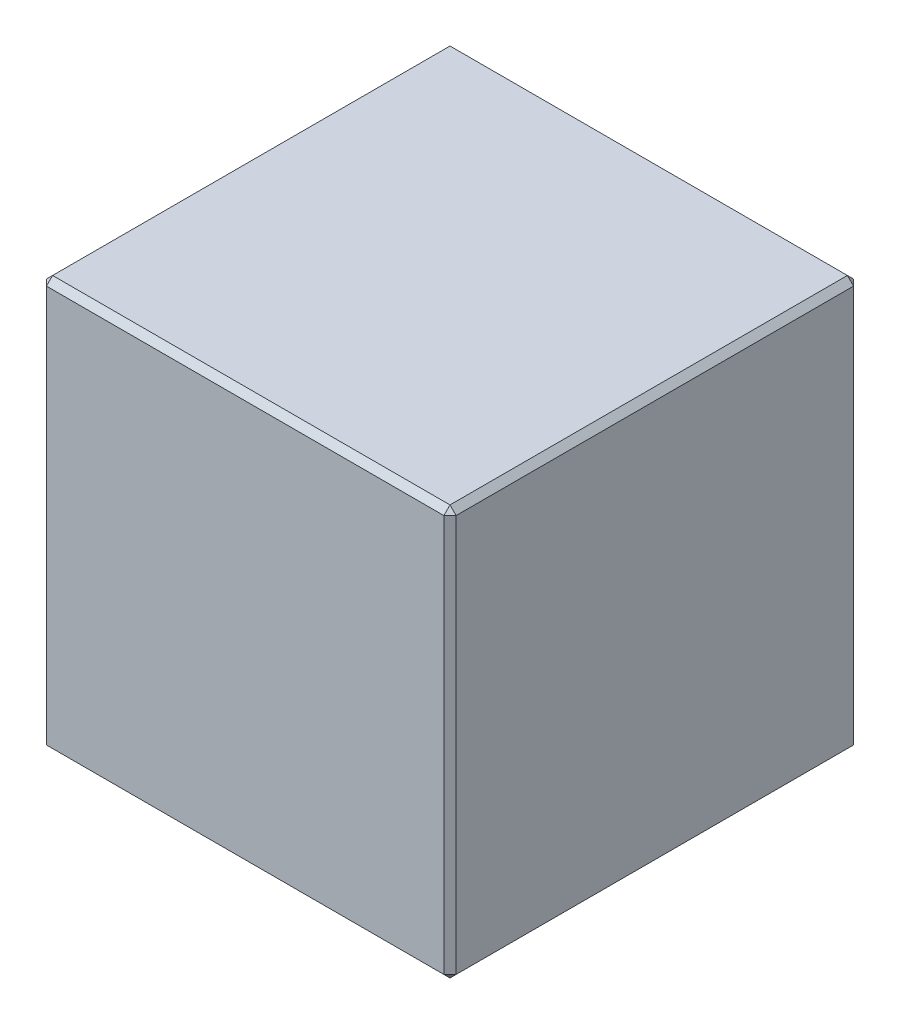
ISO-10303-21;
HEADER;
FILE_DESCRIPTION(('STEP AP214'),'2;1');
FILE_NAME('part.step','',(''),(''),'','','');
FILE_SCHEMA(('AUTOMOTIVE_DESIGN { 1 0 10303 214 1 1 1 1 }'));
ENDSEC;
DATA;
#1=APPLICATION_CONTEXT('core data for automotive mechanical design processes');
#2=APPLICATION_PROTOCOL_DEFINITION('international standard','automotive_design',2000,#1);
#3=PRODUCT_CONTEXT('',#1,'mechanical');
#4=PRODUCT('Part','Part','',(#3));
#5=PRODUCT_RELATED_PRODUCT_CATEGORY('part','',(#4));
#6=PRODUCT_DEFINITION_FORMATION('','',#4);
#7=PRODUCT_DEFINITION_CONTEXT('part definition',#1,'design');
#8=PRODUCT_DEFINITION('design','',#6,#7);
#9=PRODUCT_DEFINITION_SHAPE('','',#8);
#10=(LENGTH_UNIT() NAMED_UNIT(*) SI_UNIT(.MILLI.,.METRE.));
#11=(NAMED_UNIT(*) PLANE_ANGLE_UNIT() SI_UNIT($,.RADIAN.));
#12=(NAMED_UNIT(*) SI_UNIT($,.STERADIAN.) SOLID_ANGLE_UNIT());
#13=UNCERTAINTY_MEASURE_WITH_UNIT(LENGTH_MEASURE(1.E-05),#10,'distance_accuracy_value','');
#14=(GEOMETRIC_REPRESENTATION_CONTEXT(3) GLOBAL_UNCERTAINTY_ASSIGNED_CONTEXT((#13)) GLOBAL_UNIT_ASSIGNED_CONTEXT((#10,
#11,#12)) REPRESENTATION_CONTEXT('',''));
#15=CARTESIAN_POINT('',(0.,0.,0.));
#16=DIRECTION('',(0.,0.,1.));
#17=DIRECTION('',(1.,0.,0.));
#18=AXIS2_PLACEMENT_3D('',#15,#16,#17);
#19=CARTESIAN_POINT('',(0.,40.,0.));
#20=DIRECTION('',(1.,0.,0.));
#21=DIRECTION('',(0.,0.,-1.));
#22=AXIS2_PLACEMENT_3D('',#19,#20,#21);
#23=PLANE('',#22);
#24=DIRECTION('',(0.,-1.,0.));
#25=VECTOR('',#24,1.);
#26=CARTESIAN_POINT('',(0.,40.,-39.4));
#27=LINE('',#26,#25);
#28=CARTESIAN_POINT('',(0.,39.4,-39.4));
#29=VERTEX_POINT('',#28);
#30=CARTESIAN_POINT('',(0.,0.599999999999996,-39.4));
#31=VERTEX_POINT('',#30);
#32=EDGE_CURVE('E182',#29,#31,#27,.T.);
#33=ORIENTED_EDGE('',*,*,#32,.T.);
#34=DIRECTION('',(0.,0.,1.));
#35=VECTOR('',#34,1.);
#36=CARTESIAN_POINT('',(0.,0.599999999999996,0.));
#37=LINE('',#36,#35);
#38=CARTESIAN_POINT('',(0.,0.599999999999996,-0.600000000000003));
#39=VERTEX_POINT('',#38);
#40=EDGE_CURVE('E184',#31,#39,#37,.T.);
#41=ORIENTED_EDGE('',*,*,#40,.T.);
#42=DIRECTION('',(0.,1.,0.));
#43=VECTOR('',#42,1.);
#44=CARTESIAN_POINT('',(0.,40.,-0.600000000000003));
#45=LINE('',#44,#43);
#46=CARTESIAN_POINT('',(0.,39.4,-0.600000000000003));
#47=VERTEX_POINT('',#46);
#48=EDGE_CURVE('E178',#39,#47,#45,.T.);
#49=ORIENTED_EDGE('',*,*,#48,.T.);
#50=DIRECTION('',(0.,0.,-1.));
#51=VECTOR('',#50,1.);
#52=CARTESIAN_POINT('',(0.,39.4,0.));
#53=LINE('',#52,#51);
#54=EDGE_CURVE('E180',#47,#29,#53,.T.);
#55=ORIENTED_EDGE('',*,*,#54,.T.);
#56=EDGE_LOOP('',(#33,#41,#49,#55));
#57=FACE_BOUND('',#56,.T.);
#58=ADVANCED_FACE('F37',(#57),#23,.F.);
#59=CARTESIAN_POINT('',(0.,40.,0.));
#60=DIRECTION('',(0.,0.,-1.));
#61=DIRECTION('',(-1.,0.,0.));
#62=AXIS2_PLACEMENT_3D('',#59,#60,#61);
#63=PLANE('',#62);
#64=DIRECTION('',(-1.,0.,0.));
#65=VECTOR('',#64,1.);
#66=CARTESIAN_POINT('',(0.,39.4,0.));
#67=LINE('',#66,#65);
#68=CARTESIAN_POINT('',(39.4,39.4,0.));
#69=VERTEX_POINT('',#68);
#70=CARTESIAN_POINT('',(0.599999999999996,39.4,0.));
#71=VERTEX_POINT('',#70);
#72=EDGE_CURVE('E47',#69,#71,#67,.T.);
#73=ORIENTED_EDGE('',*,*,#72,.T.);
#74=DIRECTION('',(0.,-1.,0.));
#75=VECTOR('',#74,1.);
#76=CARTESIAN_POINT('',(0.599999999999996,40.,0.));
#77=LINE('',#76,#75);
#78=CARTESIAN_POINT('',(0.599999999999996,0.599999999999996,0.));
#79=VERTEX_POINT('',#78);
#80=EDGE_CURVE('E11',#71,#79,#77,.T.);
#81=ORIENTED_EDGE('',*,*,#80,.T.);
#82=DIRECTION('',(1.,0.,0.));
#83=VECTOR('',#82,1.);
#84=CARTESIAN_POINT('',(40.,0.599999999999996,0.));
#85=LINE('',#84,#83);
#86=CARTESIAN_POINT('',(39.4,0.599999999999996,0.));
#87=VERTEX_POINT('',#86);
#88=EDGE_CURVE('E203',#79,#87,#85,.T.);
#89=ORIENTED_EDGE('',*,*,#88,.T.);
#90=DIRECTION('',(0.,1.,0.));
#91=VECTOR('',#90,1.);
#92=CARTESIAN_POINT('',(39.4,40.,0.));
#93=LINE('',#92,#91);
#94=EDGE_CURVE('E58',#87,#69,#93,.T.);
#95=ORIENTED_EDGE('',*,*,#94,.T.);
#96=EDGE_LOOP('',(#73,#81,#89,#95));
#97=FACE_BOUND('',#96,.T.);
#98=ADVANCED_FACE('F312',(#97),#63,.F.);
#99=CARTESIAN_POINT('',(40.,40.,0.));
#100=DIRECTION('',(-1.,0.,0.));
#101=DIRECTION('',(0.,0.,1.));
#102=AXIS2_PLACEMENT_3D('',#99,#100,#101);
#103=PLANE('',#102);
#104=DIRECTION('',(0.,0.,-1.));
#105=VECTOR('',#104,1.);
#106=CARTESIAN_POINT('',(40.,0.599999999999996,-40.));
#107=LINE('',#106,#105);
#108=CARTESIAN_POINT('',(40.,0.599999999999996,-0.600000000000003));
#109=VERTEX_POINT('',#108);
#110=CARTESIAN_POINT('',(40.,0.599999999999996,-39.4));
#111=VERTEX_POINT('',#110);
#112=EDGE_CURVE('E137',#109,#111,#107,.T.);
#113=ORIENTED_EDGE('',*,*,#112,.T.);
#114=DIRECTION('',(0.,1.,0.));
#115=VECTOR('',#114,1.);
#116=CARTESIAN_POINT('',(40.,40.,-39.4));
#117=LINE('',#116,#115);
#118=CARTESIAN_POINT('',(40.,39.4,-39.4));
#119=VERTEX_POINT('',#118);
#120=EDGE_CURVE('E133',#111,#119,#117,.T.);
#121=ORIENTED_EDGE('',*,*,#120,.T.);
#122=DIRECTION('',(0.,0.,1.));
#123=VECTOR('',#122,1.);
#124=CARTESIAN_POINT('',(40.,39.4,0.));
#125=LINE('',#124,#123);
#126=CARTESIAN_POINT('',(40.,39.4,-0.600000000000003));
#127=VERTEX_POINT('',#126);
#128=EDGE_CURVE('E125',#119,#127,#125,.T.);
#129=ORIENTED_EDGE('',*,*,#128,.T.);
#130=DIRECTION('',(0.,-1.,0.));
#131=VECTOR('',#130,1.);
#132=CARTESIAN_POINT('',(40.,40.,-0.600000000000003));
#133=LINE('',#132,#131);
#134=EDGE_CURVE('E130',#127,#109,#133,.T.);
#135=ORIENTED_EDGE('',*,*,#134,.T.);
#136=EDGE_LOOP('',(#113,#121,#129,#135));
#137=FACE_BOUND('',#136,.T.);
#138=ADVANCED_FACE('F128',(#137),#103,.F.);
#139=CARTESIAN_POINT('',(0.,40.,-40.));
#140=DIRECTION('',(0.,0.,1.));
#141=DIRECTION('',(1.,0.,0.));
#142=AXIS2_PLACEMENT_3D('',#139,#140,#141);
#143=PLANE('',#142);
#144=DIRECTION('',(1.,0.,0.));
#145=VECTOR('',#144,1.);
#146=CARTESIAN_POINT('',(0.,39.4,-40.));
#147=LINE('',#146,#145);
#148=CARTESIAN_POINT('',(0.599999999999997,39.4,-40.));
#149=VERTEX_POINT('',#148);
#150=CARTESIAN_POINT('',(39.4,39.4,-40.));
#151=VERTEX_POINT('',#150);
#152=EDGE_CURVE('E198',#149,#151,#147,.T.);
#153=ORIENTED_EDGE('',*,*,#152,.T.);
#154=DIRECTION('',(0.,-1.,0.));
#155=VECTOR('',#154,1.);
#156=CARTESIAN_POINT('',(39.4,40.,-40.));
#157=LINE('',#156,#155);
#158=CARTESIAN_POINT('',(39.4,0.599999999999996,-40.));
#159=VERTEX_POINT('',#158);
#160=EDGE_CURVE('E200',#151,#159,#157,.T.);
#161=ORIENTED_EDGE('',*,*,#160,.T.);
#162=DIRECTION('',(-1.,0.,0.));
#163=VECTOR('',#162,1.);
#164=CARTESIAN_POINT('',(0.,0.599999999999996,-40.));
#165=LINE('',#164,#163);
#166=CARTESIAN_POINT('',(0.599999999999997,0.599999999999996,-40.));
#167=VERTEX_POINT('',#166);
#168=EDGE_CURVE('E196',#159,#167,#165,.T.);
#169=ORIENTED_EDGE('',*,*,#168,.T.);
#170=DIRECTION('',(0.,1.,0.));
#171=VECTOR('',#170,1.);
#172=CARTESIAN_POINT('',(0.599999999999997,40.,-40.));
#173=LINE('',#172,#171);
#174=EDGE_CURVE('E194',#167,#149,#173,.T.);
#175=ORIENTED_EDGE('',*,*,#174,.T.);
#176=EDGE_LOOP('',(#153,#161,#169,#175));
#177=FACE_BOUND('',#176,.T.);
#178=ADVANCED_FACE('F269',(#177),#143,.F.);
#179=CARTESIAN_POINT('',(0.,40.,0.));
#180=DIRECTION('',(0.,-1.,0.));
#181=DIRECTION('',(0.,0.,-1.));
#182=AXIS2_PLACEMENT_3D('',#179,#180,#181);
#183=PLANE('',#182);
#184=DIRECTION('',(1.,0.,0.));
#185=VECTOR('',#184,1.);
#186=CARTESIAN_POINT('',(0.,40.,-0.600000000000003));
#187=LINE('',#186,#185);
#188=CARTESIAN_POINT('',(0.599999999999996,40.,-0.600000000000003));
#189=VERTEX_POINT('',#188);
#190=CARTESIAN_POINT('',(39.4,40.,-0.600000000000003));
#191=VERTEX_POINT('',#190);
#192=EDGE_CURVE('E187',#189,#191,#187,.T.);
#193=ORIENTED_EDGE('',*,*,#192,.T.);
#194=DIRECTION('',(0.,0.,-1.));
#195=VECTOR('',#194,1.);
#196=CARTESIAN_POINT('',(39.4,40.,0.));
#197=LINE('',#196,#195);
#198=CARTESIAN_POINT('',(39.4,40.,-39.4));
#199=VERTEX_POINT('',#198);
#200=EDGE_CURVE('E145',#191,#199,#197,.T.);
#201=ORIENTED_EDGE('',*,*,#200,.T.);
#202=DIRECTION('',(-1.,0.,0.));
#203=VECTOR('',#202,1.);
#204=CARTESIAN_POINT('',(0.,40.,-39.4));
#205=LINE('',#204,#203);
#206=CARTESIAN_POINT('',(0.59999999999999,40.,-39.4));
#207=VERTEX_POINT('',#206);
#208=EDGE_CURVE('E191',#199,#207,#205,.T.);
#209=ORIENTED_EDGE('',*,*,#208,.T.);
#210=DIRECTION('',(0.,0.,1.));
#211=VECTOR('',#210,1.);
#212=CARTESIAN_POINT('',(0.599999999999996,40.,0.));
#213=LINE('',#212,#211);
#214=EDGE_CURVE('E189',#207,#189,#213,.T.);
#215=ORIENTED_EDGE('',*,*,#214,.T.);
#216=EDGE_LOOP('',(#193,#201,#209,#215));
#217=FACE_BOUND('',#216,.T.);
#218=ADVANCED_FACE('F300',(#217),#183,.F.);
#219=CARTESIAN_POINT('',(0.,0.,0.));
#220=DIRECTION('',(0.,-1.,0.));
#221=DIRECTION('',(0.,0.,-1.));
#222=AXIS2_PLACEMENT_3D('',#219,#220,#221);
#223=PLANE('',#222);
#224=DIRECTION('',(0.,0.,-1.));
#225=VECTOR('',#224,1.);
#226=CARTESIAN_POINT('',(0.599999999999996,0.,-40.));
#227=LINE('',#226,#225);
#228=CARTESIAN_POINT('',(0.600000000000003,0.,-0.600000000000003));
#229=VERTEX_POINT('',#228);
#230=CARTESIAN_POINT('',(0.599999999999996,0.,-39.4));
#231=VERTEX_POINT('',#230);
#232=EDGE_CURVE('E171',#229,#231,#227,.T.);
#233=ORIENTED_EDGE('',*,*,#232,.T.);
#234=DIRECTION('',(1.,0.,0.));
#235=VECTOR('',#234,1.);
#236=CARTESIAN_POINT('',(40.,0.,-39.4));
#237=LINE('',#236,#235);
#238=CARTESIAN_POINT('',(39.4,0.,-39.4));
#239=VERTEX_POINT('',#238);
#240=EDGE_CURVE('E176',#231,#239,#237,.T.);
#241=ORIENTED_EDGE('',*,*,#240,.T.);
#242=DIRECTION('',(0.,0.,1.));
#243=VECTOR('',#242,1.);
#244=CARTESIAN_POINT('',(39.4,0.,0.));
#245=LINE('',#244,#243);
#246=CARTESIAN_POINT('',(39.4,0.,-0.600000000000003));
#247=VERTEX_POINT('',#246);
#248=EDGE_CURVE('E173',#239,#247,#245,.T.);
#249=ORIENTED_EDGE('',*,*,#248,.T.);
#250=DIRECTION('',(-1.,0.,0.));
#251=VECTOR('',#250,1.);
#252=CARTESIAN_POINT('',(0.,0.,-0.600000000000003));
#253=LINE('',#252,#251);
#254=EDGE_CURVE('E169',#247,#229,#253,.T.);
#255=ORIENTED_EDGE('',*,*,#254,.T.);
#256=EDGE_LOOP('',(#233,#241,#249,#255));
#257=FACE_BOUND('',#256,.T.);
#258=ADVANCED_FACE('F302',(#257),#223,.T.);
#259=CARTESIAN_POINT('',(0.599999999999996,40.,0.));
#260=DIRECTION('',(0.707106781186552,-0.707106781186543,0.));
#261=DIRECTION('',(0.,0.,1.));
#262=AXIS2_PLACEMENT_3D('',#259,#260,#261);
#263=PLANE('',#262);
#264=DIRECTION('',(0.707106781186543,0.707106781186552,0.));
#265=VECTOR('',#264,1.);
#266=CARTESIAN_POINT('',(0.599999999999996,40.,-0.600000000000003));
#267=LINE('',#266,#265);
#268=EDGE_CURVE('E42',#189,#47,#267,.F.);
#269=ORIENTED_EDGE('',*,*,#268,.F.);
#270=ORIENTED_EDGE('',*,*,#214,.F.);
#271=DIRECTION('',(-0.707106781186543,-0.707106781186552,0.));
#272=VECTOR('',#271,1.);
#273=CARTESIAN_POINT('',(0.59999999999999,40.,-39.4));
#274=LINE('',#273,#272);
#275=EDGE_CURVE('E165',#29,#207,#274,.F.);
#276=ORIENTED_EDGE('',*,*,#275,.F.);
#277=ORIENTED_EDGE('',*,*,#54,.F.);
#278=EDGE_LOOP('',(#269,#270,#276,#277));
#279=FACE_BOUND('',#278,.T.);
#280=ADVANCED_FACE('F40',(#279),#263,.F.);
#281=CARTESIAN_POINT('',(0.599999999999996,40.,-0.600000000000003));
#282=DIRECTION('',(-0.577350269189632,0.577350269189626,0.577350269189619));
#283=DIRECTION('',(-0.707106781186543,-0.707106781186552,0.));
#284=AXIS2_PLACEMENT_3D('',#281,#282,#283);
#285=PLANE('',#284);
#286=DIRECTION('',(0.,-0.707106781186543,0.707106781186552));
#287=VECTOR('',#286,1.);
#288=CARTESIAN_POINT('',(0.599999999999996,40.,-0.600000000000003));
#289=LINE('',#288,#287);
#290=EDGE_CURVE('E248',#189,#71,#289,.T.);
#291=ORIENTED_EDGE('',*,*,#290,.F.);
#292=ORIENTED_EDGE('',*,*,#268,.T.);
#293=DIRECTION('',(-0.707106781186544,0.,-0.707106781186552));
#294=VECTOR('',#293,1.);
#295=CARTESIAN_POINT('',(0.299999999999998,39.4,-0.300000000000002));
#296=LINE('',#295,#294);
#297=EDGE_CURVE('E250',#71,#47,#296,.T.);
#298=ORIENTED_EDGE('',*,*,#297,.F.);
#299=EDGE_LOOP('',(#291,#292,#298));
#300=FACE_BOUND('',#299,.T.);
#301=ADVANCED_FACE('F295',(#300),#285,.T.);
#302=CARTESIAN_POINT('',(0.59999999999999,40.,-39.4));
#303=DIRECTION('',(-0.577350269189626,0.577350269189619,-0.577350269189633));
#304=DIRECTION('',(-0.707106781186552,0.,0.707106781186543));
#305=AXIS2_PLACEMENT_3D('',#302,#303,#304);
#306=PLANE('',#305);
#307=DIRECTION('',(0.707106781186552,0.,-0.707106781186543));
#308=VECTOR('',#307,1.);
#309=CARTESIAN_POINT('',(0.299999999999995,39.4,-39.7));
#310=LINE('',#309,#308);
#311=EDGE_CURVE('E242',#29,#149,#310,.T.);
#312=ORIENTED_EDGE('',*,*,#311,.F.);
#313=ORIENTED_EDGE('',*,*,#275,.T.);
#314=DIRECTION('',(0.,0.707106781186552,0.707106781186543));
#315=VECTOR('',#314,1.);
#316=CARTESIAN_POINT('',(0.59999999999999,40.,-39.4));
#317=LINE('',#316,#315);
#318=EDGE_CURVE('E245',#149,#207,#317,.T.);
#319=ORIENTED_EDGE('',*,*,#318,.F.);
#320=EDGE_LOOP('',(#312,#313,#319));
#321=FACE_BOUND('',#320,.T.);
#322=ADVANCED_FACE('F257',(#321),#306,.T.);
#323=CARTESIAN_POINT('',(0.599999999999996,40.,0.));
#324=DIRECTION('',(0.707106781186552,0.,-0.707106781186544));
#325=DIRECTION('',(0.,-1.,0.));
#326=AXIS2_PLACEMENT_3D('',#323,#324,#325);
#327=PLANE('',#326);
#328=ORIENTED_EDGE('',*,*,#297,.T.);
#329=ORIENTED_EDGE('',*,*,#48,.F.);
#330=DIRECTION('',(0.707106781186543,0.,0.707106781186552));
#331=VECTOR('',#330,1.);
#332=CARTESIAN_POINT('',(0.,0.599999999999996,-0.600000000000003));
#333=LINE('',#332,#331);
#334=EDGE_CURVE('E237',#79,#39,#333,.F.);
#335=ORIENTED_EDGE('',*,*,#334,.F.);
#336=ORIENTED_EDGE('',*,*,#80,.F.);
#337=EDGE_LOOP('',(#328,#329,#335,#336));
#338=FACE_BOUND('',#337,.T.);
#339=ADVANCED_FACE('F289',(#338),#327,.F.);
#340=CARTESIAN_POINT('',(0.,40.,-0.600000000000003));
#341=DIRECTION('',(0.,-0.707106781186552,-0.707106781186543));
#342=DIRECTION('',(1.,0.,0.));
#343=AXIS2_PLACEMENT_3D('',#340,#341,#342);
#344=PLANE('',#343);
#345=ORIENTED_EDGE('',*,*,#290,.T.);
#346=ORIENTED_EDGE('',*,*,#72,.F.);
#347=DIRECTION('',(0.,0.707106781186543,-0.707106781186552));
#348=VECTOR('',#347,1.);
#349=CARTESIAN_POINT('',(39.4,39.7,-0.300000000000002));
#350=LINE('',#349,#348);
#351=EDGE_CURVE('E149',#191,#69,#350,.F.);
#352=ORIENTED_EDGE('',*,*,#351,.F.);
#353=ORIENTED_EDGE('',*,*,#192,.F.);
#354=EDGE_LOOP('',(#345,#346,#352,#353));
#355=FACE_BOUND('',#354,.T.);
#356=ADVANCED_FACE('F298',(#355),#344,.F.);
#357=CARTESIAN_POINT('',(39.4,40.,0.));
#358=DIRECTION('',(-0.707106781186552,-0.707106781186543,0.));
#359=DIRECTION('',(0.,0.,-1.));
#360=AXIS2_PLACEMENT_3D('',#357,#358,#359);
#361=PLANE('',#360);
#362=DIRECTION('',(-0.707106781186543,0.707106781186551,0.));
#363=VECTOR('',#362,1.);
#364=CARTESIAN_POINT('',(39.4,40.,-39.4));
#365=LINE('',#364,#363);
#366=EDGE_CURVE('E150',#199,#119,#365,.F.);
#367=ORIENTED_EDGE('',*,*,#366,.F.);
#368=ORIENTED_EDGE('',*,*,#200,.F.);
#369=DIRECTION('',(0.707106781186543,-0.707106781186552,0.));
#370=VECTOR('',#369,1.);
#371=CARTESIAN_POINT('',(40.,39.4,-0.600000000000003));
#372=LINE('',#371,#370);
#373=EDGE_CURVE('E141',#127,#191,#372,.F.);
#374=ORIENTED_EDGE('',*,*,#373,.F.);
#375=ORIENTED_EDGE('',*,*,#128,.F.);
#376=EDGE_LOOP('',(#367,#368,#374,#375));
#377=FACE_BOUND('',#376,.T.);
#378=ADVANCED_FACE('F143',(#377),#361,.F.);
#379=CARTESIAN_POINT('',(0.,40.,-39.4));
#380=DIRECTION('',(0.,-0.707106781186543,0.707106781186552));
#381=DIRECTION('',(-1.,0.,0.));
#382=AXIS2_PLACEMENT_3D('',#379,#380,#381);
#383=PLANE('',#382);
#384=ORIENTED_EDGE('',*,*,#318,.T.);
#385=ORIENTED_EDGE('',*,*,#208,.F.);
#386=DIRECTION('',(0.,-0.707106781186552,-0.707106781186543));
#387=VECTOR('',#386,1.);
#388=CARTESIAN_POINT('',(39.4,40.,-39.4));
#389=LINE('',#388,#387);
#390=EDGE_CURVE('E233',#151,#199,#389,.F.);
#391=ORIENTED_EDGE('',*,*,#390,.F.);
#392=ORIENTED_EDGE('',*,*,#152,.F.);
#393=EDGE_LOOP('',(#384,#385,#391,#392));
#394=FACE_BOUND('',#393,.T.);
#395=ADVANCED_FACE('F265',(#394),#383,.F.);
#396=CARTESIAN_POINT('',(0.,40.,-39.4));
#397=DIRECTION('',(0.707106781186543,0.,0.707106781186552));
#398=DIRECTION('',(0.,-1.,0.));
#399=AXIS2_PLACEMENT_3D('',#396,#397,#398);
#400=PLANE('',#399);
#401=ORIENTED_EDGE('',*,*,#311,.T.);
#402=ORIENTED_EDGE('',*,*,#174,.F.);
#403=DIRECTION('',(-0.707106781186552,0.,0.707106781186543));
#404=VECTOR('',#403,1.);
#405=CARTESIAN_POINT('',(0.299999999999995,0.599999999999996,-39.7));
#406=LINE('',#405,#404);
#407=EDGE_CURVE('E230',#31,#167,#406,.F.);
#408=ORIENTED_EDGE('',*,*,#407,.F.);
#409=ORIENTED_EDGE('',*,*,#32,.F.);
#410=EDGE_LOOP('',(#401,#402,#408,#409));
#411=FACE_BOUND('',#410,.T.);
#412=ADVANCED_FACE('F275',(#411),#400,.F.);
#413=CARTESIAN_POINT('',(0.,0.599999999999996,0.));
#414=DIRECTION('',(-0.707106781186543,-0.707106781186552,0.));
#415=DIRECTION('',(0.,0.,-1.));
#416=AXIS2_PLACEMENT_3D('',#413,#414,#415);
#417=PLANE('',#416);
#418=DIRECTION('',(0.707106781186552,-0.707106781186543,0.));
#419=VECTOR('',#418,1.);
#420=CARTESIAN_POINT('',(0.,0.599999999999996,-0.600000000000003));
#421=LINE('',#420,#419);
#422=EDGE_CURVE('E239',#39,#229,#421,.T.);
#423=ORIENTED_EDGE('',*,*,#422,.F.);
#424=ORIENTED_EDGE('',*,*,#40,.F.);
#425=DIRECTION('',(-0.707106781186552,0.707106781186543,0.));
#426=VECTOR('',#425,1.);
#427=CARTESIAN_POINT('',(0.599999999999996,0.,-39.4));
#428=LINE('',#427,#426);
#429=EDGE_CURVE('E227',#231,#31,#428,.T.);
#430=ORIENTED_EDGE('',*,*,#429,.F.);
#431=ORIENTED_EDGE('',*,*,#232,.F.);
#432=EDGE_LOOP('',(#423,#424,#430,#431));
#433=FACE_BOUND('',#432,.T.);
#434=ADVANCED_FACE('F281',(#433),#417,.T.);
#435=CARTESIAN_POINT('',(0.,0.599999999999996,-0.600000000000003));
#436=DIRECTION('',(-0.577350269189626,-0.577350269189633,0.577350269189619));
#437=DIRECTION('',(0.707106781186552,-0.707106781186543,0.));
#438=AXIS2_PLACEMENT_3D('',#435,#436,#437);
#439=PLANE('',#438);
#440=ORIENTED_EDGE('',*,*,#334,.T.);
#441=ORIENTED_EDGE('',*,*,#422,.T.);
#442=DIRECTION('',(0.,0.707106781186543,0.707106781186552));
#443=VECTOR('',#442,1.);
#444=CARTESIAN_POINT('',(0.6,0.299999999999998,-0.300000000000002));
#445=LINE('',#444,#443);
#446=EDGE_CURVE('E156',#79,#229,#445,.F.);
#447=ORIENTED_EDGE('',*,*,#446,.F.);
#448=EDGE_LOOP('',(#440,#441,#447));
#449=FACE_BOUND('',#448,.T.);
#450=ADVANCED_FACE('F387',(#449),#439,.T.);
#451=CARTESIAN_POINT('',(40.,39.4,-0.600000000000003));
#452=DIRECTION('',(0.577350269189633,0.577350269189626,0.577350269189619));
#453=DIRECTION('',(-0.707106781186543,0.707106781186552,0.));
#454=AXIS2_PLACEMENT_3D('',#451,#452,#453);
#455=PLANE('',#454);
#456=ORIENTED_EDGE('',*,*,#373,.T.);
#457=ORIENTED_EDGE('',*,*,#351,.T.);
#458=DIRECTION('',(-0.707106781186543,0.,0.707106781186552));
#459=VECTOR('',#458,1.);
#460=CARTESIAN_POINT('',(40.,39.4,-0.600000000000003));
#461=LINE('',#460,#459);
#462=EDGE_CURVE('E153',#127,#69,#461,.T.);
#463=ORIENTED_EDGE('',*,*,#462,.F.);
#464=EDGE_LOOP('',(#456,#457,#463));
#465=FACE_BOUND('',#464,.T.);
#466=ADVANCED_FACE('F154',(#465),#455,.T.);
#467=CARTESIAN_POINT('',(39.4,40.,-39.4));
#468=DIRECTION('',(0.577350269189632,0.577350269189619,-0.577350269189626));
#469=DIRECTION('',(-0.707106781186543,0.,-0.707106781186552));
#470=AXIS2_PLACEMENT_3D('',#467,#468,#469);
#471=PLANE('',#470);
#472=ORIENTED_EDGE('',*,*,#390,.T.);
#473=ORIENTED_EDGE('',*,*,#366,.T.);
#474=DIRECTION('',(0.707106781186543,0.,0.707106781186552));
#475=VECTOR('',#474,1.);
#476=CARTESIAN_POINT('',(39.7,39.4,-39.7));
#477=LINE('',#476,#475);
#478=EDGE_CURVE('E157',#151,#119,#477,.T.);
#479=ORIENTED_EDGE('',*,*,#478,.F.);
#480=EDGE_LOOP('',(#472,#473,#479));
#481=FACE_BOUND('',#480,.T.);
#482=ADVANCED_FACE('F374',(#481),#471,.T.);
#483=CARTESIAN_POINT('',(0.599999999999996,0.,-39.4));
#484=DIRECTION('',(-0.577350269189619,-0.577350269189633,-0.577350269189626));
#485=DIRECTION('',(0.,0.707106781186543,-0.707106781186552));
#486=AXIS2_PLACEMENT_3D('',#483,#484,#485);
#487=PLANE('',#486);
#488=ORIENTED_EDGE('',*,*,#429,.T.);
#489=ORIENTED_EDGE('',*,*,#407,.T.);
#490=DIRECTION('',(0.,-0.707106781186543,0.707106781186552));
#491=VECTOR('',#490,1.);
#492=CARTESIAN_POINT('',(0.599999999999996,0.,-39.4));
#493=LINE('',#492,#491);
#494=EDGE_CURVE('E220',#231,#167,#493,.F.);
#495=ORIENTED_EDGE('',*,*,#494,.F.);
#496=EDGE_LOOP('',(#488,#489,#495));
#497=FACE_BOUND('',#496,.T.);
#498=ADVANCED_FACE('F367',(#497),#487,.T.);
#499=CARTESIAN_POINT('',(0.,0.599999999999996,0.));
#500=DIRECTION('',(0.,-0.707106781186552,0.707106781186543));
#501=DIRECTION('',(-1.,0.,0.));
#502=AXIS2_PLACEMENT_3D('',#499,#500,#501);
#503=PLANE('',#502);
#504=ORIENTED_EDGE('',*,*,#446,.T.);
#505=ORIENTED_EDGE('',*,*,#254,.F.);
#506=DIRECTION('',(0.,-0.707106781186543,-0.707106781186552));
#507=VECTOR('',#506,1.);
#508=CARTESIAN_POINT('',(39.4,0.,-0.600000000000003));
#509=LINE('',#508,#507);
#510=EDGE_CURVE('E217',#87,#247,#509,.T.);
#511=ORIENTED_EDGE('',*,*,#510,.F.);
#512=ORIENTED_EDGE('',*,*,#88,.F.);
#513=EDGE_LOOP('',(#504,#505,#511,#512));
#514=FACE_BOUND('',#513,.T.);
#515=ADVANCED_FACE('F361',(#514),#503,.T.);
#516=CARTESIAN_POINT('',(40.,40.,-0.600000000000003));
#517=DIRECTION('',(-0.707106781186552,0.,-0.707106781186543));
#518=DIRECTION('',(0.,-1.,0.));
#519=AXIS2_PLACEMENT_3D('',#516,#517,#518);
#520=PLANE('',#519);
#521=ORIENTED_EDGE('',*,*,#462,.T.);
#522=ORIENTED_EDGE('',*,*,#94,.F.);
#523=DIRECTION('',(0.707106781186543,0.,-0.707106781186552));
#524=VECTOR('',#523,1.);
#525=CARTESIAN_POINT('',(39.7,0.599999999999996,-0.299999999999998));
#526=LINE('',#525,#524);
#527=EDGE_CURVE('E161',#109,#87,#526,.F.);
#528=ORIENTED_EDGE('',*,*,#527,.F.);
#529=ORIENTED_EDGE('',*,*,#134,.F.);
#530=EDGE_LOOP('',(#521,#522,#528,#529));
#531=FACE_BOUND('',#530,.T.);
#532=ADVANCED_FACE('F159',(#531),#520,.F.);
#533=CARTESIAN_POINT('',(39.4,40.,-40.));
#534=DIRECTION('',(-0.707106781186552,0.,0.707106781186543));
#535=DIRECTION('',(0.,-1.,0.));
#536=AXIS2_PLACEMENT_3D('',#533,#534,#535);
#537=PLANE('',#536);
#538=ORIENTED_EDGE('',*,*,#478,.T.);
#539=ORIENTED_EDGE('',*,*,#120,.F.);
#540=DIRECTION('',(-0.707106781186543,0.,-0.707106781186552));
#541=VECTOR('',#540,1.);
#542=CARTESIAN_POINT('',(40.,0.599999999999996,-39.4));
#543=LINE('',#542,#541);
#544=EDGE_CURVE('E213',#159,#111,#543,.F.);
#545=ORIENTED_EDGE('',*,*,#544,.F.);
#546=ORIENTED_EDGE('',*,*,#160,.F.);
#547=EDGE_LOOP('',(#538,#539,#545,#546));
#548=FACE_BOUND('',#547,.T.);
#549=ADVANCED_FACE('F348',(#548),#537,.F.);
#550=CARTESIAN_POINT('',(0.,0.599999999999996,-40.));
#551=DIRECTION('',(0.,-0.707106781186552,-0.707106781186543));
#552=DIRECTION('',(1.,0.,0.));
#553=AXIS2_PLACEMENT_3D('',#550,#551,#552);
#554=PLANE('',#553);
#555=ORIENTED_EDGE('',*,*,#494,.T.);
#556=ORIENTED_EDGE('',*,*,#168,.F.);
#557=DIRECTION('',(0.,0.707106781186543,-0.707106781186552));
#558=VECTOR('',#557,1.);
#559=CARTESIAN_POINT('',(39.4,0.300000000000002,-39.7));
#560=LINE('',#559,#558);
#561=EDGE_CURVE('E211',#239,#159,#560,.T.);
#562=ORIENTED_EDGE('',*,*,#561,.F.);
#563=ORIENTED_EDGE('',*,*,#240,.F.);
#564=EDGE_LOOP('',(#555,#556,#562,#563));
#565=FACE_BOUND('',#564,.T.);
#566=ADVANCED_FACE('F341',(#565),#554,.T.);
#567=CARTESIAN_POINT('',(39.4,0.,-0.600000000000003));
#568=DIRECTION('',(0.577350269189624,-0.577350269189637,0.577350269189617));
#569=DIRECTION('',(0.707106781186556,0.707106781186539,0.));
#570=AXIS2_PLACEMENT_3D('',#567,#568,#569);
#571=PLANE('',#570);
#572=ORIENTED_EDGE('',*,*,#527,.T.);
#573=ORIENTED_EDGE('',*,*,#510,.T.);
#574=DIRECTION('',(0.707106781186556,0.707106781186539,0.));
#575=VECTOR('',#574,1.);
#576=CARTESIAN_POINT('',(39.4,0.,-0.600000000000003));
#577=LINE('',#576,#575);
#578=EDGE_CURVE('E209',#109,#247,#577,.F.);
#579=ORIENTED_EDGE('',*,*,#578,.F.);
#580=EDGE_LOOP('',(#572,#573,#579));
#581=FACE_BOUND('',#580,.T.);
#582=ADVANCED_FACE('F334',(#581),#571,.T.);
#583=CARTESIAN_POINT('',(40.,0.599999999999996,-39.4));
#584=DIRECTION('',(0.577350269189624,-0.577350269189637,-0.577350269189617));
#585=DIRECTION('',(0.707106781186556,0.707106781186539,0.));
#586=AXIS2_PLACEMENT_3D('',#583,#584,#585);
#587=PLANE('',#586);
#588=ORIENTED_EDGE('',*,*,#561,.T.);
#589=ORIENTED_EDGE('',*,*,#544,.T.);
#590=DIRECTION('',(-0.707106781186556,-0.707106781186539,0.));
#591=VECTOR('',#590,1.);
#592=CARTESIAN_POINT('',(40.,0.599999999999996,-39.4));
#593=LINE('',#592,#591);
#594=EDGE_CURVE('E207',#239,#111,#593,.F.);
#595=ORIENTED_EDGE('',*,*,#594,.F.);
#596=EDGE_LOOP('',(#588,#589,#595));
#597=FACE_BOUND('',#596,.T.);
#598=ADVANCED_FACE('F327',(#597),#587,.T.);
#599=CARTESIAN_POINT('',(40.,0.599999999999996,0.));
#600=DIRECTION('',(0.707106781186539,-0.707106781186556,0.));
#601=DIRECTION('',(0.,0.,1.));
#602=AXIS2_PLACEMENT_3D('',#599,#600,#601);
#603=PLANE('',#602);
#604=ORIENTED_EDGE('',*,*,#578,.T.);
#605=ORIENTED_EDGE('',*,*,#248,.F.);
#606=ORIENTED_EDGE('',*,*,#594,.T.);
#607=ORIENTED_EDGE('',*,*,#112,.F.);
#608=EDGE_LOOP('',(#604,#605,#606,#607));
#609=FACE_BOUND('',#608,.T.);
#610=ADVANCED_FACE('F321',(#609),#603,.T.);
#611=CLOSED_SHELL('',(#58,#98,#138,#178,#218,#258,#280,#301,#322,#339,#356,#378,#395,#412,#434,
#450,#466,#482,#498,#515,#532,#549,#566,#582,#598,#610));
#612=MANIFOLD_SOLID_BREP('B2',#611);
#613=ADVANCED_BREP_SHAPE_REPRESENTATION('',(#18,#612),#14);
#614=SHAPE_DEFINITION_REPRESENTATION(#9,#613);
ENDSEC;
END-ISO-10303-21;
